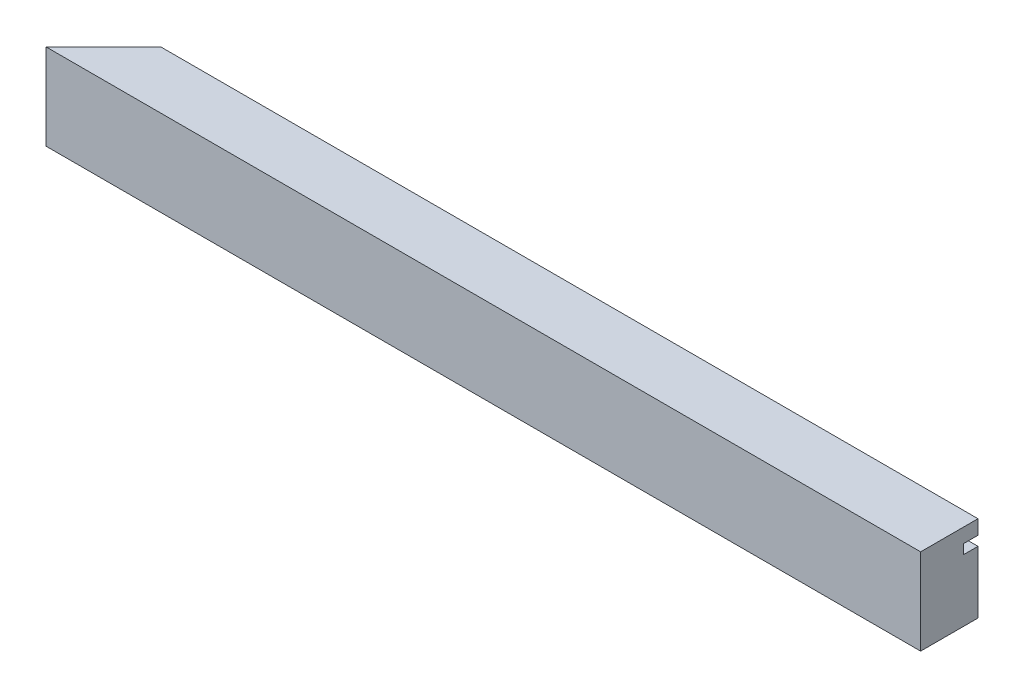
ISO-10303-21;
HEADER;
FILE_DESCRIPTION(('STEP AP214'),'2;1');
FILE_NAME('part.step','',(''),(''),'','','');
FILE_SCHEMA(('AUTOMOTIVE_DESIGN { 1 0 10303 214 1 1 1 1 }'));
ENDSEC;
DATA;
#1=APPLICATION_CONTEXT('core data for automotive mechanical design processes');
#2=APPLICATION_PROTOCOL_DEFINITION('international standard','automotive_design',2000,#1);
#3=PRODUCT_CONTEXT('',#1,'mechanical');
#4=PRODUCT('Part','Part','',(#3));
#5=PRODUCT_RELATED_PRODUCT_CATEGORY('part','',(#4));
#6=PRODUCT_DEFINITION_FORMATION('','',#4);
#7=PRODUCT_DEFINITION_CONTEXT('part definition',#1,'design');
#8=PRODUCT_DEFINITION('design','',#6,#7);
#9=PRODUCT_DEFINITION_SHAPE('','',#8);
#10=(LENGTH_UNIT() NAMED_UNIT(*) SI_UNIT(.MILLI.,.METRE.));
#11=(NAMED_UNIT(*) PLANE_ANGLE_UNIT() SI_UNIT($,.RADIAN.));
#12=(NAMED_UNIT(*) SI_UNIT($,.STERADIAN.) SOLID_ANGLE_UNIT());
#13=UNCERTAINTY_MEASURE_WITH_UNIT(LENGTH_MEASURE(1.E-05),#10,'distance_accuracy_value','');
#14=(GEOMETRIC_REPRESENTATION_CONTEXT(3) GLOBAL_UNCERTAINTY_ASSIGNED_CONTEXT((#13)) GLOBAL_UNIT_ASSIGNED_CONTEXT((#10,
#11,#12)) REPRESENTATION_CONTEXT('',''));
#15=CARTESIAN_POINT('',(0.,0.,0.));
#16=DIRECTION('',(0.,0.,1.));
#17=DIRECTION('',(1.,0.,0.));
#18=AXIS2_PLACEMENT_3D('',#15,#16,#17);
#19=CARTESIAN_POINT('',(183.,18.,4.23272528138341E-13));
#20=DIRECTION('',(1.,0.,0.));
#21=DIRECTION('',(0.,0.,-1.));
#22=AXIS2_PLACEMENT_3D('',#19,#20,#21);
#23=PLANE('',#22);
#24=DIRECTION('',(0.,-1.,0.));
#25=VECTOR('',#24,1.);
#26=CARTESIAN_POINT('',(183.,18.,-12.));
#27=LINE('',#26,#25);
#28=CARTESIAN_POINT('',(183.,13.,-12.));
#29=VERTEX_POINT('',#28);
#30=CARTESIAN_POINT('',(183.,0.,-12.));
#31=VERTEX_POINT('',#30);
#32=EDGE_CURVE('E131',#29,#31,#27,.T.);
#33=ORIENTED_EDGE('',*,*,#32,.F.);
#34=DIRECTION('',(0.,0.,1.));
#35=VECTOR('',#34,1.);
#36=CARTESIAN_POINT('',(183.,13.,4.23272528138341E-13));
#37=LINE('',#36,#35);
#38=CARTESIAN_POINT('',(183.,13.,-9.));
#39=VERTEX_POINT('',#38);
#40=EDGE_CURVE('E152',#29,#39,#37,.T.);
#41=ORIENTED_EDGE('',*,*,#40,.T.);
#42=DIRECTION('',(0.,1.,0.));
#43=VECTOR('',#42,1.);
#44=CARTESIAN_POINT('',(183.,18.,-9.));
#45=LINE('',#44,#43);
#46=CARTESIAN_POINT('',(183.,15.,-9.));
#47=VERTEX_POINT('',#46);
#48=EDGE_CURVE('E124',#39,#47,#45,.T.);
#49=ORIENTED_EDGE('',*,*,#48,.T.);
#50=DIRECTION('',(0.,0.,-1.));
#51=VECTOR('',#50,1.);
#52=CARTESIAN_POINT('',(183.,15.,4.23272528138341E-13));
#53=LINE('',#52,#51);
#54=CARTESIAN_POINT('',(183.,15.,-12.));
#55=VERTEX_POINT('',#54);
#56=EDGE_CURVE('E110',#47,#55,#53,.T.);
#57=ORIENTED_EDGE('',*,*,#56,.T.);
#58=CARTESIAN_POINT('',(183.,18.,-12.));
#59=VERTEX_POINT('',#58);
#60=EDGE_CURVE('E121',#59,#55,#27,.T.);
#61=ORIENTED_EDGE('',*,*,#60,.F.);
#62=DIRECTION('',(0.,0.,1.));
#63=VECTOR('',#62,1.);
#64=CARTESIAN_POINT('',(183.,18.,4.23272528138341E-13));
#65=LINE('',#64,#63);
#66=CARTESIAN_POINT('',(183.,18.,0.));
#67=VERTEX_POINT('',#66);
#68=EDGE_CURVE('E157',#59,#67,#65,.T.);
#69=ORIENTED_EDGE('',*,*,#68,.T.);
#70=DIRECTION('',(0.,-1.,0.));
#71=VECTOR('',#70,1.);
#72=CARTESIAN_POINT('',(183.,18.,0.));
#73=LINE('',#72,#71);
#74=CARTESIAN_POINT('',(183.,0.,0.));
#75=VERTEX_POINT('',#74);
#76=EDGE_CURVE('E85',#67,#75,#73,.T.);
#77=ORIENTED_EDGE('',*,*,#76,.T.);
#78=DIRECTION('',(0.,0.,1.));
#79=VECTOR('',#78,1.);
#80=CARTESIAN_POINT('',(183.,0.,4.23272528138341E-13));
#81=LINE('',#80,#79);
#82=EDGE_CURVE('E164',#31,#75,#81,.T.);
#83=ORIENTED_EDGE('',*,*,#82,.F.);
#84=EDGE_LOOP('',(#33,#41,#49,#57,#61,#69,#77,#83));
#85=FACE_BOUND('',#84,.T.);
#86=ADVANCED_FACE('F38',(#85),#23,.T.);
#87=CARTESIAN_POINT('',(0.,18.,-12.));
#88=DIRECTION('',(0.,0.,-1.));
#89=DIRECTION('',(-1.,0.,0.));
#90=AXIS2_PLACEMENT_3D('',#87,#88,#89);
#91=PLANE('',#90);
#92=DIRECTION('',(0.,-1.,0.));
#93=VECTOR('',#92,1.);
#94=CARTESIAN_POINT('',(12.0000000000001,18.,-12.));
#95=LINE('',#94,#93);
#96=CARTESIAN_POINT('',(12.0000000000003,13.,-12.0000000000003));
#97=VERTEX_POINT('',#96);
#98=CARTESIAN_POINT('',(12.0000000000001,0.,-12.));
#99=VERTEX_POINT('',#98);
#100=EDGE_CURVE('E171',#97,#99,#95,.T.);
#101=ORIENTED_EDGE('',*,*,#100,.F.);
#102=DIRECTION('',(-1.,0.,0.));
#103=VECTOR('',#102,1.);
#104=CARTESIAN_POINT('',(413.342815169043,13.,-11.9999999999995));
#105=LINE('',#104,#103);
#106=EDGE_CURVE('E125',#29,#97,#105,.T.);
#107=ORIENTED_EDGE('',*,*,#106,.F.);
#108=ORIENTED_EDGE('',*,*,#32,.T.);
#109=DIRECTION('',(1.,0.,0.));
#110=VECTOR('',#109,1.);
#111=CARTESIAN_POINT('',(0.,0.,-12.));
#112=LINE('',#111,#110);
#113=EDGE_CURVE('E167',#99,#31,#112,.T.);
#114=ORIENTED_EDGE('',*,*,#113,.F.);
#115=EDGE_LOOP('',(#101,#107,#108,#114));
#116=FACE_BOUND('',#115,.T.);
#117=ADVANCED_FACE('F180',(#116),#91,.T.);
#118=ORIENTED_EDGE('',*,*,#60,.T.);
#119=DIRECTION('',(-1.,0.,0.));
#120=VECTOR('',#119,1.);
#121=CARTESIAN_POINT('',(413.342815169043,15.,-11.9999999999995));
#122=LINE('',#121,#120);
#123=CARTESIAN_POINT('',(12.0000000000003,15.,-12.0000000000003));
#124=VERTEX_POINT('',#123);
#125=EDGE_CURVE('E107',#55,#124,#122,.T.);
#126=ORIENTED_EDGE('',*,*,#125,.T.);
#127=CARTESIAN_POINT('',(12.0000000000001,18.,-12.));
#128=VERTEX_POINT('',#127);
#129=EDGE_CURVE('E134',#128,#124,#95,.T.);
#130=ORIENTED_EDGE('',*,*,#129,.F.);
#131=DIRECTION('',(1.,0.,0.));
#132=VECTOR('',#131,1.);
#133=CARTESIAN_POINT('',(0.,18.,-12.));
#134=LINE('',#133,#132);
#135=EDGE_CURVE('E130',#128,#59,#134,.T.);
#136=ORIENTED_EDGE('',*,*,#135,.T.);
#137=EDGE_LOOP('',(#118,#126,#130,#136));
#138=FACE_BOUND('',#137,.T.);
#139=ADVANCED_FACE('F128',(#138),#91,.T.);
#140=CARTESIAN_POINT('',(0.,18.,0.));
#141=DIRECTION('',(-0.707106781186545,0.,-0.70710678118655));
#142=DIRECTION('',(-0.70710678118655,0.,0.707106781186545));
#143=AXIS2_PLACEMENT_3D('',#140,#141,#142);
#144=PLANE('',#143);
#145=DIRECTION('',(0.,-1.,0.));
#146=VECTOR('',#145,1.);
#147=CARTESIAN_POINT('',(9.00000000000047,18.,-9.0000000000004));
#148=LINE('',#147,#146);
#149=CARTESIAN_POINT('',(8.99999999999954,15.,-8.99999999999947));
#150=VERTEX_POINT('',#149);
#151=CARTESIAN_POINT('',(9.00000000000056,13.,-9.0000000000004));
#152=VERTEX_POINT('',#151);
#153=EDGE_CURVE('E46',#150,#152,#148,.T.);
#154=ORIENTED_EDGE('',*,*,#153,.T.);
#155=DIRECTION('',(0.70710678118655,0.,-0.707106781186545));
#156=VECTOR('',#155,1.);
#157=CARTESIAN_POINT('',(0.,13.,0.));
#158=LINE('',#157,#156);
#159=EDGE_CURVE('E11',#152,#97,#158,.T.);
#160=ORIENTED_EDGE('',*,*,#159,.T.);
#161=ORIENTED_EDGE('',*,*,#100,.T.);
#162=DIRECTION('',(0.70710678118655,0.,-0.707106781186545));
#163=VECTOR('',#162,1.);
#164=CARTESIAN_POINT('',(0.,0.,0.));
#165=LINE('',#164,#163);
#166=CARTESIAN_POINT('',(0.,0.,0.));
#167=VERTEX_POINT('',#166);
#168=EDGE_CURVE('E158',#167,#99,#165,.T.);
#169=ORIENTED_EDGE('',*,*,#168,.F.);
#170=DIRECTION('',(0.,-1.,0.));
#171=VECTOR('',#170,1.);
#172=CARTESIAN_POINT('',(0.,18.,0.));
#173=LINE('',#172,#171);
#174=CARTESIAN_POINT('',(0.,18.,0.));
#175=VERTEX_POINT('',#174);
#176=EDGE_CURVE('E62',#175,#167,#173,.T.);
#177=ORIENTED_EDGE('',*,*,#176,.F.);
#178=DIRECTION('',(0.70710678118655,0.,-0.707106781186545));
#179=VECTOR('',#178,1.);
#180=CARTESIAN_POINT('',(0.,18.,0.));
#181=LINE('',#180,#179);
#182=EDGE_CURVE('E161',#175,#128,#181,.T.);
#183=ORIENTED_EDGE('',*,*,#182,.T.);
#184=ORIENTED_EDGE('',*,*,#129,.T.);
#185=DIRECTION('',(-0.70710678118655,0.,0.707106781186545));
#186=VECTOR('',#185,1.);
#187=CARTESIAN_POINT('',(0.,15.,0.));
#188=LINE('',#187,#186);
#189=EDGE_CURVE('E112',#124,#150,#188,.T.);
#190=ORIENTED_EDGE('',*,*,#189,.T.);
#191=EDGE_LOOP('',(#154,#160,#161,#169,#177,#183,#184,#190));
#192=FACE_BOUND('',#191,.T.);
#193=ADVANCED_FACE('F139',(#192),#144,.T.);
#194=CARTESIAN_POINT('',(0.,18.,0.));
#195=DIRECTION('',(0.,0.,1.));
#196=DIRECTION('',(1.,0.,0.));
#197=AXIS2_PLACEMENT_3D('',#194,#195,#196);
#198=PLANE('',#197);
#199=DIRECTION('',(-1.,0.,0.));
#200=VECTOR('',#199,1.);
#201=CARTESIAN_POINT('',(0.,0.,0.));
#202=LINE('',#201,#200);
#203=EDGE_CURVE('E154',#75,#167,#202,.T.);
#204=ORIENTED_EDGE('',*,*,#203,.F.);
#205=ORIENTED_EDGE('',*,*,#76,.F.);
#206=DIRECTION('',(-1.,0.,0.));
#207=VECTOR('',#206,1.);
#208=CARTESIAN_POINT('',(0.,18.,0.));
#209=LINE('',#208,#207);
#210=EDGE_CURVE('E155',#67,#175,#209,.T.);
#211=ORIENTED_EDGE('',*,*,#210,.T.);
#212=ORIENTED_EDGE('',*,*,#176,.T.);
#213=EDGE_LOOP('',(#204,#205,#211,#212));
#214=FACE_BOUND('',#213,.T.);
#215=ADVANCED_FACE('F40',(#214),#198,.T.);
#216=CARTESIAN_POINT('',(0.,18.,0.));
#217=DIRECTION('',(0.,1.,0.));
#218=DIRECTION('',(0.,0.,1.));
#219=AXIS2_PLACEMENT_3D('',#216,#217,#218);
#220=PLANE('',#219);
#221=ORIENTED_EDGE('',*,*,#210,.F.);
#222=ORIENTED_EDGE('',*,*,#68,.F.);
#223=ORIENTED_EDGE('',*,*,#135,.F.);
#224=ORIENTED_EDGE('',*,*,#182,.F.);
#225=EDGE_LOOP('',(#221,#222,#223,#224));
#226=FACE_BOUND('',#225,.T.);
#227=ADVANCED_FACE('F175',(#226),#220,.T.);
#228=CARTESIAN_POINT('',(0.,0.,0.));
#229=DIRECTION('',(0.,1.,0.));
#230=DIRECTION('',(0.,0.,1.));
#231=AXIS2_PLACEMENT_3D('',#228,#229,#230);
#232=PLANE('',#231);
#233=ORIENTED_EDGE('',*,*,#203,.T.);
#234=ORIENTED_EDGE('',*,*,#168,.T.);
#235=ORIENTED_EDGE('',*,*,#113,.T.);
#236=ORIENTED_EDGE('',*,*,#82,.T.);
#237=EDGE_LOOP('',(#233,#234,#235,#236));
#238=FACE_BOUND('',#237,.T.);
#239=ADVANCED_FACE('F178',(#238),#232,.F.);
#240=CARTESIAN_POINT('',(413.342815169043,13.,-11.9999999999995));
#241=DIRECTION('',(0.,1.,0.));
#242=DIRECTION('',(0.,0.,1.));
#243=AXIS2_PLACEMENT_3D('',#240,#241,#242);
#244=PLANE('',#243);
#245=ORIENTED_EDGE('',*,*,#40,.F.);
#246=ORIENTED_EDGE('',*,*,#106,.T.);
#247=ORIENTED_EDGE('',*,*,#159,.F.);
#248=DIRECTION('',(-1.,0.,0.));
#249=VECTOR('',#248,1.);
#250=CARTESIAN_POINT('',(413.342815169043,13.,-8.99999999999947));
#251=LINE('',#250,#249);
#252=EDGE_CURVE('E145',#39,#152,#251,.T.);
#253=ORIENTED_EDGE('',*,*,#252,.F.);
#254=EDGE_LOOP('',(#245,#246,#247,#253));
#255=FACE_BOUND('',#254,.T.);
#256=ADVANCED_FACE('F182',(#255),#244,.T.);
#257=CARTESIAN_POINT('',(413.342815169043,15.,-8.99999999999947));
#258=DIRECTION('',(0.,0.,-1.));
#259=DIRECTION('',(-1.,0.,0.));
#260=AXIS2_PLACEMENT_3D('',#257,#258,#259);
#261=PLANE('',#260);
#262=ORIENTED_EDGE('',*,*,#48,.F.);
#263=ORIENTED_EDGE('',*,*,#252,.T.);
#264=ORIENTED_EDGE('',*,*,#153,.F.);
#265=DIRECTION('',(-1.,0.,0.));
#266=VECTOR('',#265,1.);
#267=CARTESIAN_POINT('',(413.342815169043,15.,-8.99999999999947));
#268=LINE('',#267,#266);
#269=EDGE_CURVE('E53',#47,#150,#268,.T.);
#270=ORIENTED_EDGE('',*,*,#269,.F.);
#271=EDGE_LOOP('',(#262,#263,#264,#270));
#272=FACE_BOUND('',#271,.T.);
#273=ADVANCED_FACE('F143',(#272),#261,.T.);
#274=CARTESIAN_POINT('',(413.342815169043,15.,-11.9999999999995));
#275=DIRECTION('',(0.,-1.,0.));
#276=DIRECTION('',(0.,0.,-1.));
#277=AXIS2_PLACEMENT_3D('',#274,#275,#276);
#278=PLANE('',#277);
#279=ORIENTED_EDGE('',*,*,#56,.F.);
#280=ORIENTED_EDGE('',*,*,#269,.T.);
#281=ORIENTED_EDGE('',*,*,#189,.F.);
#282=ORIENTED_EDGE('',*,*,#125,.F.);
#283=EDGE_LOOP('',(#279,#280,#281,#282));
#284=FACE_BOUND('',#283,.T.);
#285=ADVANCED_FACE('F109',(#284),#278,.T.);
#286=CLOSED_SHELL('',(#86,#117,#139,#193,#215,#227,#239,#256,#273,#285));
#287=MANIFOLD_SOLID_BREP('B2',#286);
#288=ADVANCED_BREP_SHAPE_REPRESENTATION('',(#18,#287),#14);
#289=SHAPE_DEFINITION_REPRESENTATION(#9,#288);
ENDSEC;
END-ISO-10303-21;
